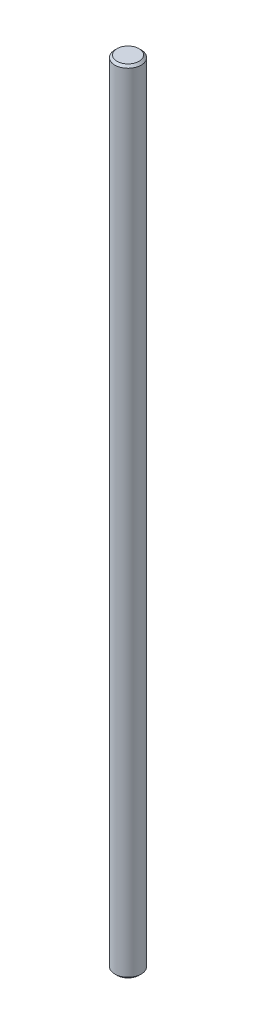
ISO-10303-21;
HEADER;
FILE_DESCRIPTION(('STEP AP214'),'2;1');
FILE_NAME('part.step','',(''),(''),'','','');
FILE_SCHEMA(('AUTOMOTIVE_DESIGN { 1 0 10303 214 1 1 1 1 }'));
ENDSEC;
DATA;
#1=APPLICATION_CONTEXT('core data for automotive mechanical design processes');
#2=APPLICATION_PROTOCOL_DEFINITION('international standard','automotive_design',2000,#1);
#3=PRODUCT_CONTEXT('',#1,'mechanical');
#4=PRODUCT('Part','Part','',(#3));
#5=PRODUCT_RELATED_PRODUCT_CATEGORY('part','',(#4));
#6=PRODUCT_DEFINITION_FORMATION('','',#4);
#7=PRODUCT_DEFINITION_CONTEXT('part definition',#1,'design');
#8=PRODUCT_DEFINITION('design','',#6,#7);
#9=PRODUCT_DEFINITION_SHAPE('','',#8);
#10=(LENGTH_UNIT() NAMED_UNIT(*) SI_UNIT(.MILLI.,.METRE.));
#11=(NAMED_UNIT(*) PLANE_ANGLE_UNIT() SI_UNIT($,.RADIAN.));
#12=(NAMED_UNIT(*) SI_UNIT($,.STERADIAN.) SOLID_ANGLE_UNIT());
#13=UNCERTAINTY_MEASURE_WITH_UNIT(LENGTH_MEASURE(1.E-05),#10,'distance_accuracy_value','');
#14=(GEOMETRIC_REPRESENTATION_CONTEXT(3) GLOBAL_UNCERTAINTY_ASSIGNED_CONTEXT((#13)) GLOBAL_UNIT_ASSIGNED_CONTEXT((#10,
#11,#12)) REPRESENTATION_CONTEXT('',''));
#15=CARTESIAN_POINT('',(0.,0.,0.));
#16=DIRECTION('',(0.,0.,1.));
#17=DIRECTION('',(1.,0.,0.));
#18=AXIS2_PLACEMENT_3D('',#15,#16,#17);
#19=CARTESIAN_POINT('',(0.,180.,0.));
#20=DIRECTION('',(0.,-1.,0.));
#21=DIRECTION('',(0.,0.,-1.));
#22=AXIS2_PLACEMENT_3D('',#19,#20,#21);
#23=CYLINDRICAL_SURFACE('',#22,3.);
#24=CARTESIAN_POINT('',(0.,0.500000000000111,0.));
#25=DIRECTION('',(0.,1.,0.));
#26=DIRECTION('',(0.,0.,1.));
#27=AXIS2_PLACEMENT_3D('',#24,#25,#26);
#28=CIRCLE('',#27,3.);
#29=CARTESIAN_POINT('',(0.,0.500000000000084,-3.));
#30=VERTEX_POINT('',#29);
#31=EDGE_CURVE('E47',#30,#30,#28,.T.);
#32=CARTESIAN_POINT('',(0.,179.5,0.));
#33=DIRECTION('',(0.,1.,0.));
#34=DIRECTION('',(0.,0.,1.));
#35=AXIS2_PLACEMENT_3D('',#32,#33,#34);
#36=CIRCLE('',#35,3.);
#37=CARTESIAN_POINT('',(0.,179.5,-3.));
#38=VERTEX_POINT('',#37);
#39=EDGE_CURVE('E51',#38,#38,#36,.F.);
#40=CARTESIAN_POINT('',(0.,0.500000000000084,-3.));
#41=CARTESIAN_POINT('',(0.,2.36458333333342,-3.));
#42=CARTESIAN_POINT('',(0.,4.22916666666676,-3.));
#43=CARTESIAN_POINT('',(0.,7.95833333333342,-3.));
#44=CARTESIAN_POINT('',(0.,9.82291666666675,-3.));
#45=CARTESIAN_POINT('',(0.,13.5520833333334,-3.));
#46=CARTESIAN_POINT('',(0.,15.4166666666667,-3.));
#47=CARTESIAN_POINT('',(0.,19.1458333333334,-3.));
#48=CARTESIAN_POINT('',(0.,21.0104166666668,-3.));
#49=CARTESIAN_POINT('',(0.,24.7395833333334,-3.));
#50=CARTESIAN_POINT('',(0.,26.6041666666667,-3.));
#51=CARTESIAN_POINT('',(0.,30.3333333333334,-3.));
#52=CARTESIAN_POINT('',(0.,32.1979166666667,-3.));
#53=CARTESIAN_POINT('',(0.,35.9270833333334,-3.));
#54=CARTESIAN_POINT('',(0.,37.7916666666667,-3.));
#55=CARTESIAN_POINT('',(0.,41.5208333333334,-3.));
#56=CARTESIAN_POINT('',(0.,43.3854166666668,-3.));
#57=CARTESIAN_POINT('',(0.,47.1145833333334,-3.));
#58=CARTESIAN_POINT('',(0.,48.9791666666667,-3.));
#59=CARTESIAN_POINT('',(0.,52.7083333333334,-3.));
#60=CARTESIAN_POINT('',(0.,54.5729166666667,-3.));
#61=CARTESIAN_POINT('',(0.,58.3020833333334,-3.));
#62=CARTESIAN_POINT('',(0.,60.1666666666667,-3.));
#63=CARTESIAN_POINT('',(0.,63.8958333333334,-3.));
#64=CARTESIAN_POINT('',(0.,65.7604166666667,-3.));
#65=CARTESIAN_POINT('',(0.,69.4895833333334,-3.));
#66=CARTESIAN_POINT('',(0.,71.3541666666667,-3.));
#67=CARTESIAN_POINT('',(0.,75.0833333333334,-3.));
#68=CARTESIAN_POINT('',(0.,76.9479166666667,-3.));
#69=CARTESIAN_POINT('',(0.,80.6770833333334,-3.));
#70=CARTESIAN_POINT('',(0.,82.5416666666667,-3.));
#71=CARTESIAN_POINT('',(0.,86.2708333333334,-3.));
#72=CARTESIAN_POINT('',(0.,88.1354166666667,-3.));
#73=CARTESIAN_POINT('',(0.,91.8645833333334,-3.));
#74=CARTESIAN_POINT('',(0.,93.7291666666667,-3.));
#75=CARTESIAN_POINT('',(0.,97.4583333333334,-3.));
#76=CARTESIAN_POINT('',(0.,99.3229166666667,-3.));
#77=CARTESIAN_POINT('',(0.,103.052083333333,-3.));
#78=CARTESIAN_POINT('',(0.,104.916666666667,-3.));
#79=CARTESIAN_POINT('',(0.,108.645833333333,-3.));
#80=CARTESIAN_POINT('',(0.,110.510416666667,-3.));
#81=CARTESIAN_POINT('',(0.,114.239583333333,-3.));
#82=CARTESIAN_POINT('',(0.,116.104166666667,-3.));
#83=CARTESIAN_POINT('',(0.,119.833333333333,-3.));
#84=CARTESIAN_POINT('',(0.,121.697916666667,-3.));
#85=CARTESIAN_POINT('',(0.,125.427083333333,-3.));
#86=CARTESIAN_POINT('',(0.,127.291666666667,-3.));
#87=CARTESIAN_POINT('',(0.,131.020833333333,-3.));
#88=CARTESIAN_POINT('',(0.,132.885416666667,-3.));
#89=CARTESIAN_POINT('',(0.,136.614583333333,-3.));
#90=CARTESIAN_POINT('',(0.,138.479166666667,-3.));
#91=CARTESIAN_POINT('',(0.,142.208333333333,-3.));
#92=CARTESIAN_POINT('',(0.,144.072916666667,-3.));
#93=CARTESIAN_POINT('',(0.,147.802083333333,-3.));
#94=CARTESIAN_POINT('',(0.,149.666666666667,-3.));
#95=CARTESIAN_POINT('',(0.,153.395833333333,-3.));
#96=CARTESIAN_POINT('',(0.,155.260416666667,-3.));
#97=CARTESIAN_POINT('',(0.,158.989583333333,-3.));
#98=CARTESIAN_POINT('',(0.,160.854166666667,-3.));
#99=CARTESIAN_POINT('',(0.,164.583333333333,-3.));
#100=CARTESIAN_POINT('',(0.,166.447916666667,-3.));
#101=CARTESIAN_POINT('',(0.,170.177083333333,-3.));
#102=CARTESIAN_POINT('',(0.,172.041666666667,-3.));
#103=CARTESIAN_POINT('',(0.,175.770833333333,-3.));
#104=CARTESIAN_POINT('',(0.,177.635416666667,-3.));
#105=CARTESIAN_POINT('',(0.,179.5,-3.));
#106=B_SPLINE_CURVE_WITH_KNOTS('',3,(#40,#41,#42,#43,#44,#45,#46,#47,#48,#49,#50,#51,#52,#53,
#54,#55,#56,#57,#58,#59,#60,#61,#62,#63,#64,#65,#66,#67,#68,#69,#70,#71,#72,#73,#74,#75,#76,#77,
#78,#79,#80,#81,#82,#83,#84,#85,#86,#87,#88,#89,#90,#91,#92,#93,#94,#95,#96,#97,#98,#99,#100,
#101,#102,#103,#104,#105),.UNSPECIFIED.,.F.,.F.,(4,2,2,2,2,2,2,2,2,2,2,2,2,2,2,2,2,2,2,2,2,2,2,
2,2,2,2,2,2,2,2,2,4),(0.,5.59375000000001,11.1875,16.78125,22.375,27.96875,33.5625,39.15625,
44.75,50.34375,55.9375,61.53125,67.125,72.71875,78.3125,83.90625,89.5,95.09375,100.6875,
106.28125,111.875,117.46875,123.0625,128.65625,134.25,139.84375,145.4375,151.03125,156.625,
162.21875,167.8125,173.40625,179.),.UNSPECIFIED.);
#107=EDGE_CURVE('BSEAM35',#30,#38,#106,.T.);
#108=ORIENTED_EDGE('',*,*,#31,.T.);
#109=ORIENTED_EDGE('',*,*,#39,.T.);
#110=ORIENTED_EDGE('',*,*,#107,.T.);
#111=ORIENTED_EDGE('',*,*,#107,.F.);
#112=EDGE_LOOP('',(#108,#110,#109,#111));
#113=FACE_BOUND('',#112,.T.);
#114=ADVANCED_FACE('F35',(#113),#23,.T.);
#115=CARTESIAN_POINT('',(0.,180.,0.));
#116=DIRECTION('',(0.,1.,0.));
#117=DIRECTION('',(0.,0.,1.));
#118=AXIS2_PLACEMENT_3D('',#115,#116,#117);
#119=PLANE('',#118);
#120=CARTESIAN_POINT('',(0.,180.,0.));
#121=DIRECTION('',(0.,1.,0.));
#122=DIRECTION('',(0.,0.,1.));
#123=AXIS2_PLACEMENT_3D('',#120,#121,#122);
#124=CIRCLE('',#123,2.50000000000006);
#125=CARTESIAN_POINT('',(0.,180.,2.50000000000006));
#126=VERTEX_POINT('',#125);
#127=EDGE_CURVE('E10',#126,#126,#124,.T.);
#128=ORIENTED_EDGE('',*,*,#127,.T.);
#129=EDGE_LOOP('',(#128));
#130=FACE_BOUND('',#129,.T.);
#131=ADVANCED_FACE('F67',(#130),#119,.T.);
#132=CARTESIAN_POINT('',(0.,0.,0.));
#133=DIRECTION('',(0.,1.,0.));
#134=DIRECTION('',(0.,0.,1.));
#135=AXIS2_PLACEMENT_3D('',#132,#133,#134);
#136=PLANE('',#135);
#137=CARTESIAN_POINT('',(0.,0.,0.));
#138=DIRECTION('',(0.,1.,0.));
#139=DIRECTION('',(0.,0.,1.));
#140=AXIS2_PLACEMENT_3D('',#137,#138,#139);
#141=CIRCLE('',#140,2.4999999999999);
#142=CARTESIAN_POINT('',(0.,0.,2.4999999999999));
#143=VERTEX_POINT('',#142);
#144=EDGE_CURVE('E43',#143,#143,#141,.F.);
#145=ORIENTED_EDGE('',*,*,#144,.T.);
#146=EDGE_LOOP('',(#145));
#147=FACE_BOUND('',#146,.T.);
#148=ADVANCED_FACE('F64',(#147),#136,.F.);
#149=CARTESIAN_POINT('',(0.,0.500000000000111,0.));
#150=DIRECTION('',(0.,1.,0.));
#151=DIRECTION('',(0.,0.,1.));
#152=AXIS2_PLACEMENT_3D('',#149,#150,#151);
#153=CONICAL_SURFACE('',#152,3.,0.785398163397433);
#154=ORIENTED_EDGE('',*,*,#144,.F.);
#155=EDGE_LOOP('',(#154));
#156=FACE_BOUND('',#155,.T.);
#157=ORIENTED_EDGE('',*,*,#31,.F.);
#158=EDGE_LOOP('',(#157));
#159=FACE_BOUND('',#158,.T.);
#160=ADVANCED_FACE('F60',(#156,#159),#153,.T.);
#161=CARTESIAN_POINT('',(0.,180.,0.));
#162=DIRECTION('',(0.,-1.,0.));
#163=DIRECTION('',(0.,0.,-1.));
#164=AXIS2_PLACEMENT_3D('',#161,#162,#163);
#165=CONICAL_SURFACE('',#164,2.50000000000006,0.785398163397474);
#166=ORIENTED_EDGE('',*,*,#39,.F.);
#167=EDGE_LOOP('',(#166));
#168=FACE_BOUND('',#167,.T.);
#169=ORIENTED_EDGE('',*,*,#127,.F.);
#170=EDGE_LOOP('',(#169));
#171=FACE_BOUND('',#170,.T.);
#172=ADVANCED_FACE('F38',(#168,#171),#165,.T.);
#173=CLOSED_SHELL('',(#114,#131,#148,#160,#172));
#174=MANIFOLD_SOLID_BREP('B2',#173);
#175=ADVANCED_BREP_SHAPE_REPRESENTATION('',(#18,#174),#14);
#176=SHAPE_DEFINITION_REPRESENTATION(#9,#175);
ENDSEC;
END-ISO-10303-21;
